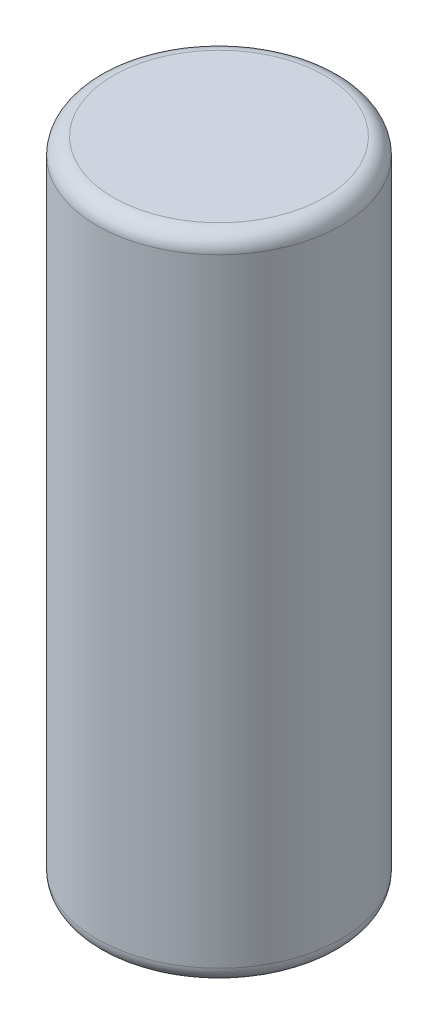
ISO-10303-21;
HEADER;
FILE_DESCRIPTION(('STEP AP214'),'2;1');
FILE_NAME('part.step','',(''),(''),'','','');
FILE_SCHEMA(('AUTOMOTIVE_DESIGN { 1 0 10303 214 1 1 1 1 }'));
ENDSEC;
DATA;
#1=APPLICATION_CONTEXT('core data for automotive mechanical design processes');
#2=APPLICATION_PROTOCOL_DEFINITION('international standard','automotive_design',2000,#1);
#3=PRODUCT_CONTEXT('',#1,'mechanical');
#4=PRODUCT('Part','Part','',(#3));
#5=PRODUCT_RELATED_PRODUCT_CATEGORY('part','',(#4));
#6=PRODUCT_DEFINITION_FORMATION('','',#4);
#7=PRODUCT_DEFINITION_CONTEXT('part definition',#1,'design');
#8=PRODUCT_DEFINITION('design','',#6,#7);
#9=PRODUCT_DEFINITION_SHAPE('','',#8);
#10=(LENGTH_UNIT() NAMED_UNIT(*) SI_UNIT(.MILLI.,.METRE.));
#11=(NAMED_UNIT(*) PLANE_ANGLE_UNIT() SI_UNIT($,.RADIAN.));
#12=(NAMED_UNIT(*) SI_UNIT($,.STERADIAN.) SOLID_ANGLE_UNIT());
#13=UNCERTAINTY_MEASURE_WITH_UNIT(LENGTH_MEASURE(1.E-05),#10,'distance_accuracy_value','');
#14=(GEOMETRIC_REPRESENTATION_CONTEXT(3) GLOBAL_UNCERTAINTY_ASSIGNED_CONTEXT((#13)) GLOBAL_UNIT_ASSIGNED_CONTEXT((#10,
#11,#12)) REPRESENTATION_CONTEXT('',''));
#15=CARTESIAN_POINT('',(0.,0.,0.));
#16=DIRECTION('',(0.,0.,1.));
#17=DIRECTION('',(1.,0.,0.));
#18=AXIS2_PLACEMENT_3D('',#15,#16,#17);
#19=CARTESIAN_POINT('',(0.,200.,0.));
#20=DIRECTION('',(0.,-1.,0.));
#21=DIRECTION('',(0.,0.,-1.));
#22=AXIS2_PLACEMENT_3D('',#19,#20,#21);
#23=CYLINDRICAL_SURFACE('',#22,75.);
#24=CARTESIAN_POINT('',(0.,-190.,0.));
#25=DIRECTION('',(0.,1.,0.));
#26=DIRECTION('',(0.,0.,1.));
#27=AXIS2_PLACEMENT_3D('',#24,#25,#26);
#28=CIRCLE('',#27,75.);
#29=CARTESIAN_POINT('',(0.,-190.,-75.));
#30=VERTEX_POINT('',#29);
#31=EDGE_CURVE('E46',#30,#30,#28,.T.);
#32=CARTESIAN_POINT('',(0.,190.,0.));
#33=DIRECTION('',(0.,1.,0.));
#34=DIRECTION('',(0.,0.,1.));
#35=AXIS2_PLACEMENT_3D('',#32,#33,#34);
#36=CIRCLE('',#35,75.);
#37=CARTESIAN_POINT('',(0.,190.,-75.));
#38=VERTEX_POINT('',#37);
#39=EDGE_CURVE('E50',#38,#38,#36,.F.);
#40=CARTESIAN_POINT('',(0.,-190.,-75.));
#41=CARTESIAN_POINT('',(0.,-186.041666666667,-75.));
#42=CARTESIAN_POINT('',(0.,-182.083333333334,-75.));
#43=CARTESIAN_POINT('',(0.,-174.166666666667,-75.));
#44=CARTESIAN_POINT('',(0.,-170.208333333333,-75.));
#45=CARTESIAN_POINT('',(0.,-162.291666666667,-75.));
#46=CARTESIAN_POINT('',(0.,-158.333333333333,-75.));
#47=CARTESIAN_POINT('',(0.,-150.416666666667,-75.));
#48=CARTESIAN_POINT('',(0.,-146.458333333333,-75.));
#49=CARTESIAN_POINT('',(0.,-138.541666666667,-75.));
#50=CARTESIAN_POINT('',(0.,-134.583333333333,-75.));
#51=CARTESIAN_POINT('',(0.,-126.666666666667,-75.));
#52=CARTESIAN_POINT('',(0.,-122.708333333333,-75.));
#53=CARTESIAN_POINT('',(0.,-114.791666666667,-75.));
#54=CARTESIAN_POINT('',(0.,-110.833333333333,-75.));
#55=CARTESIAN_POINT('',(0.,-102.916666666667,-75.));
#56=CARTESIAN_POINT('',(0.,-98.9583333333335,-75.));
#57=CARTESIAN_POINT('',(0.,-91.0416666666668,-75.));
#58=CARTESIAN_POINT('',(0.,-87.0833333333334,-75.));
#59=CARTESIAN_POINT('',(0.,-79.1666666666667,-75.));
#60=CARTESIAN_POINT('',(0.,-75.2083333333334,-75.));
#61=CARTESIAN_POINT('',(0.,-67.2916666666667,-75.));
#62=CARTESIAN_POINT('',(0.,-63.3333333333334,-75.));
#63=CARTESIAN_POINT('',(0.,-55.4166666666668,-75.));
#64=CARTESIAN_POINT('',(0.,-51.4583333333334,-75.));
#65=CARTESIAN_POINT('',(0.,-43.5416666666668,-75.));
#66=CARTESIAN_POINT('',(0.,-39.5833333333334,-75.));
#67=CARTESIAN_POINT('',(0.,-31.6666666666667,-75.));
#68=CARTESIAN_POINT('',(0.,-27.7083333333334,-75.));
#69=CARTESIAN_POINT('',(0.,-19.7916666666667,-75.));
#70=CARTESIAN_POINT('',(0.,-15.8333333333334,-75.));
#71=CARTESIAN_POINT('',(0.,-7.91666666666674,-75.));
#72=CARTESIAN_POINT('',(0.,-3.9583333333334,-75.));
#73=CARTESIAN_POINT('',(0.,3.95833333333328,-75.));
#74=CARTESIAN_POINT('',(0.,7.91666666666663,-75.));
#75=CARTESIAN_POINT('',(0.,15.8333333333333,-75.));
#76=CARTESIAN_POINT('',(0.,19.7916666666666,-75.));
#77=CARTESIAN_POINT('',(0.,27.7083333333333,-75.));
#78=CARTESIAN_POINT('',(0.,31.6666666666666,-75.));
#79=CARTESIAN_POINT('',(0.,39.5833333333333,-75.));
#80=CARTESIAN_POINT('',(0.,43.5416666666666,-75.));
#81=CARTESIAN_POINT('',(0.,51.4583333333333,-75.));
#82=CARTESIAN_POINT('',(0.,55.4166666666667,-75.));
#83=CARTESIAN_POINT('',(0.,63.3333333333333,-75.));
#84=CARTESIAN_POINT('',(0.,67.2916666666667,-75.));
#85=CARTESIAN_POINT('',(0.,75.2083333333333,-75.));
#86=CARTESIAN_POINT('',(0.,79.1666666666666,-75.));
#87=CARTESIAN_POINT('',(0.,87.0833333333333,-75.));
#88=CARTESIAN_POINT('',(0.,91.0416666666667,-75.));
#89=CARTESIAN_POINT('',(0.,98.9583333333334,-75.));
#90=CARTESIAN_POINT('',(0.,102.916666666667,-75.));
#91=CARTESIAN_POINT('',(0.,110.833333333333,-75.));
#92=CARTESIAN_POINT('',(0.,114.791666666667,-75.));
#93=CARTESIAN_POINT('',(0.,122.708333333333,-75.));
#94=CARTESIAN_POINT('',(0.,126.666666666667,-75.));
#95=CARTESIAN_POINT('',(0.,134.583333333333,-75.));
#96=CARTESIAN_POINT('',(0.,138.541666666667,-75.));
#97=CARTESIAN_POINT('',(0.,146.458333333333,-75.));
#98=CARTESIAN_POINT('',(0.,150.416666666667,-75.));
#99=CARTESIAN_POINT('',(0.,158.333333333333,-75.));
#100=CARTESIAN_POINT('',(0.,162.291666666667,-75.));
#101=CARTESIAN_POINT('',(0.,170.208333333333,-75.));
#102=CARTESIAN_POINT('',(0.,174.166666666667,-75.));
#103=CARTESIAN_POINT('',(0.,182.083333333333,-75.));
#104=CARTESIAN_POINT('',(0.,186.041666666667,-75.));
#105=CARTESIAN_POINT('',(0.,190.,-75.));
#106=B_SPLINE_CURVE_WITH_KNOTS('',3,(#40,#41,#42,#43,#44,#45,#46,#47,#48,#49,#50,#51,#52,#53,
#54,#55,#56,#57,#58,#59,#60,#61,#62,#63,#64,#65,#66,#67,#68,#69,#70,#71,#72,#73,#74,#75,#76,#77,
#78,#79,#80,#81,#82,#83,#84,#85,#86,#87,#88,#89,#90,#91,#92,#93,#94,#95,#96,#97,#98,#99,#100,
#101,#102,#103,#104,#105),.UNSPECIFIED.,.F.,.F.,(4,2,2,2,2,2,2,2,2,2,2,2,2,2,2,2,2,2,2,2,2,2,2,
2,2,2,2,2,2,2,2,2,4),(0.,11.875,23.75,35.625,47.5,59.3750000000001,71.25,83.1250000000001,
95.0000000000001,106.875,118.75,130.625,142.5,154.375,166.25,178.125,190.,201.875,213.75,
225.625,237.5,249.375,261.25,273.125,285.,296.875,308.75,320.625,332.5,344.375,356.25,368.125,
380.),.UNSPECIFIED.);
#107=EDGE_CURVE('BSEAM35',#30,#38,#106,.T.);
#108=ORIENTED_EDGE('',*,*,#31,.T.);
#109=ORIENTED_EDGE('',*,*,#39,.T.);
#110=ORIENTED_EDGE('',*,*,#107,.T.);
#111=ORIENTED_EDGE('',*,*,#107,.F.);
#112=EDGE_LOOP('',(#108,#110,#109,#111));
#113=FACE_BOUND('',#112,.T.);
#114=ADVANCED_FACE('F35',(#113),#23,.T.);
#115=CARTESIAN_POINT('',(0.,200.,0.));
#116=DIRECTION('',(0.,1.,0.));
#117=DIRECTION('',(0.,0.,1.));
#118=AXIS2_PLACEMENT_3D('',#115,#116,#117);
#119=PLANE('',#118);
#120=CARTESIAN_POINT('',(0.,200.,0.));
#121=DIRECTION('',(0.,1.,0.));
#122=DIRECTION('',(0.,0.,1.));
#123=AXIS2_PLACEMENT_3D('',#120,#121,#122);
#124=CIRCLE('',#123,65.);
#125=CARTESIAN_POINT('',(0.,200.,65.));
#126=VERTEX_POINT('',#125);
#127=EDGE_CURVE('E10',#126,#126,#124,.T.);
#128=ORIENTED_EDGE('',*,*,#127,.T.);
#129=EDGE_LOOP('',(#128));
#130=FACE_BOUND('',#129,.T.);
#131=ADVANCED_FACE('F66',(#130),#119,.T.);
#132=CARTESIAN_POINT('',(0.,-200.,0.));
#133=DIRECTION('',(0.,1.,0.));
#134=DIRECTION('',(0.,0.,1.));
#135=AXIS2_PLACEMENT_3D('',#132,#133,#134);
#136=PLANE('',#135);
#137=CARTESIAN_POINT('',(0.,-200.,0.));
#138=DIRECTION('',(0.,1.,0.));
#139=DIRECTION('',(0.,0.,1.));
#140=AXIS2_PLACEMENT_3D('',#137,#138,#139);
#141=CIRCLE('',#140,65.);
#142=CARTESIAN_POINT('',(0.,-200.,65.));
#143=VERTEX_POINT('',#142);
#144=EDGE_CURVE('E42',#143,#143,#141,.F.);
#145=ORIENTED_EDGE('',*,*,#144,.T.);
#146=EDGE_LOOP('',(#145));
#147=FACE_BOUND('',#146,.T.);
#148=ADVANCED_FACE('F63',(#147),#136,.F.);
#149=CARTESIAN_POINT('',(0.,-190.,0.));
#150=DIRECTION('',(0.,1.,0.));
#151=DIRECTION('',(0.,0.,1.));
#152=AXIS2_PLACEMENT_3D('',#149,#150,#151);
#153=TOROIDAL_SURFACE('',#152,65.,10.);
#154=ORIENTED_EDGE('',*,*,#144,.F.);
#155=EDGE_LOOP('',(#154));
#156=FACE_BOUND('',#155,.T.);
#157=ORIENTED_EDGE('',*,*,#31,.F.);
#158=EDGE_LOOP('',(#157));
#159=FACE_BOUND('',#158,.T.);
#160=ADVANCED_FACE('F59',(#156,#159),#153,.T.);
#161=CARTESIAN_POINT('',(0.,190.,0.));
#162=DIRECTION('',(0.,1.,0.));
#163=DIRECTION('',(0.,0.,1.));
#164=AXIS2_PLACEMENT_3D('',#161,#162,#163);
#165=TOROIDAL_SURFACE('',#164,65.,10.);
#166=ORIENTED_EDGE('',*,*,#39,.F.);
#167=EDGE_LOOP('',(#166));
#168=FACE_BOUND('',#167,.T.);
#169=ORIENTED_EDGE('',*,*,#127,.F.);
#170=EDGE_LOOP('',(#169));
#171=FACE_BOUND('',#170,.T.);
#172=ADVANCED_FACE('F37',(#168,#171),#165,.T.);
#173=CLOSED_SHELL('',(#114,#131,#148,#160,#172));
#174=MANIFOLD_SOLID_BREP('B2',#173);
#175=ADVANCED_BREP_SHAPE_REPRESENTATION('',(#18,#174),#14);
#176=SHAPE_DEFINITION_REPRESENTATION(#9,#175);
ENDSEC;
END-ISO-10303-21;
